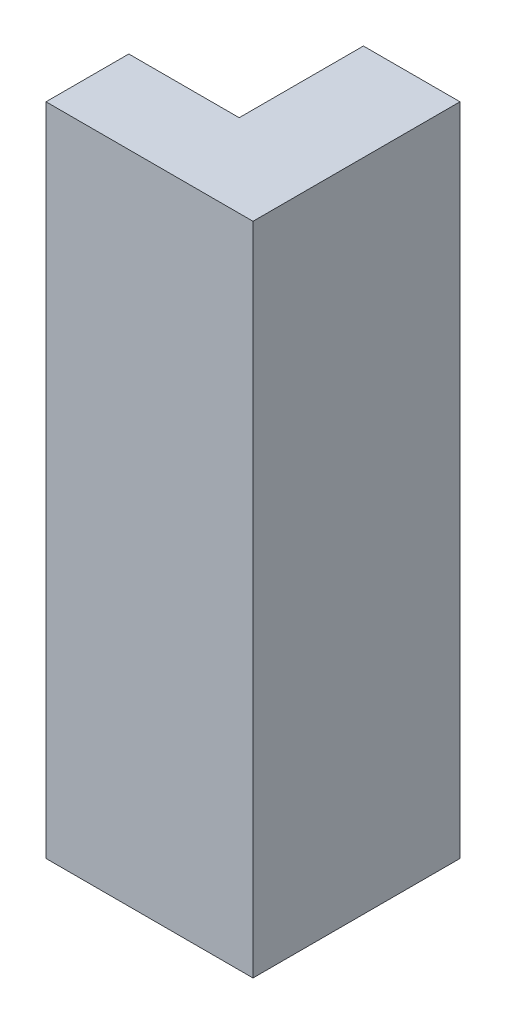
ISO-10303-21;
HEADER;
FILE_DESCRIPTION(('STEP AP214'),'2;1');
FILE_NAME('part.step','',(''),(''),'','','');
FILE_SCHEMA(('AUTOMOTIVE_DESIGN { 1 0 10303 214 1 1 1 1 }'));
ENDSEC;
DATA;
#1=APPLICATION_CONTEXT('core data for automotive mechanical design processes');
#2=APPLICATION_PROTOCOL_DEFINITION('international standard','automotive_design',2000,#1);
#3=PRODUCT_CONTEXT('',#1,'mechanical');
#4=PRODUCT('Part','Part','',(#3));
#5=PRODUCT_RELATED_PRODUCT_CATEGORY('part','',(#4));
#6=PRODUCT_DEFINITION_FORMATION('','',#4);
#7=PRODUCT_DEFINITION_CONTEXT('part definition',#1,'design');
#8=PRODUCT_DEFINITION('design','',#6,#7);
#9=PRODUCT_DEFINITION_SHAPE('','',#8);
#10=(LENGTH_UNIT() NAMED_UNIT(*) SI_UNIT(.MILLI.,.METRE.));
#11=(NAMED_UNIT(*) PLANE_ANGLE_UNIT() SI_UNIT($,.RADIAN.));
#12=(NAMED_UNIT(*) SI_UNIT($,.STERADIAN.) SOLID_ANGLE_UNIT());
#13=UNCERTAINTY_MEASURE_WITH_UNIT(LENGTH_MEASURE(1.E-05),#10,'distance_accuracy_value','');
#14=(GEOMETRIC_REPRESENTATION_CONTEXT(3) GLOBAL_UNCERTAINTY_ASSIGNED_CONTEXT((#13)) GLOBAL_UNIT_ASSIGNED_CONTEXT((#10,
#11,#12)) REPRESENTATION_CONTEXT('',''));
#15=CARTESIAN_POINT('',(0.,0.,0.));
#16=DIRECTION('',(0.,0.,1.));
#17=DIRECTION('',(1.,0.,0.));
#18=AXIS2_PLACEMENT_3D('',#15,#16,#17);
#19=CARTESIAN_POINT('',(87.5,1187.25,187.5));
#20=DIRECTION('',(-1.,0.,0.));
#21=DIRECTION('',(0.,0.,1.));
#22=AXIS2_PLACEMENT_3D('',#19,#20,#21);
#23=PLANE('',#22);
#24=DIRECTION('',(0.,0.,-1.));
#25=VECTOR('',#24,1.);
#26=CARTESIAN_POINT('',(87.5,0.,187.5));
#27=LINE('',#26,#25);
#28=CARTESIAN_POINT('',(87.5,0.,187.5));
#29=VERTEX_POINT('',#28);
#30=CARTESIAN_POINT('',(87.5,0.,-187.5));
#31=VERTEX_POINT('',#30);
#32=EDGE_CURVE('E127',#29,#31,#27,.T.);
#33=ORIENTED_EDGE('',*,*,#32,.T.);
#34=DIRECTION('',(0.,-1.,0.));
#35=VECTOR('',#34,1.);
#36=CARTESIAN_POINT('',(87.5,1187.25,-187.5));
#37=LINE('',#36,#35);
#38=CARTESIAN_POINT('',(87.5,1187.25,-187.5));
#39=VERTEX_POINT('',#38);
#40=EDGE_CURVE('E11',#39,#31,#37,.T.);
#41=ORIENTED_EDGE('',*,*,#40,.F.);
#42=DIRECTION('',(0.,0.,-1.));
#43=VECTOR('',#42,1.);
#44=CARTESIAN_POINT('',(87.5,1187.25,187.5));
#45=LINE('',#44,#43);
#46=CARTESIAN_POINT('',(87.5,1187.25,187.5));
#47=VERTEX_POINT('',#46);
#48=EDGE_CURVE('E137',#47,#39,#45,.T.);
#49=ORIENTED_EDGE('',*,*,#48,.F.);
#50=DIRECTION('',(0.,-1.,0.));
#51=VECTOR('',#50,1.);
#52=CARTESIAN_POINT('',(87.5,1187.25,187.5));
#53=LINE('',#52,#51);
#54=EDGE_CURVE('E123',#47,#29,#53,.T.);
#55=ORIENTED_EDGE('',*,*,#54,.T.);
#56=EDGE_LOOP('',(#33,#41,#49,#55));
#57=FACE_BOUND('',#56,.T.);
#58=ADVANCED_FACE('F43',(#57),#23,.F.);
#59=CARTESIAN_POINT('',(-87.5,1187.25,-187.5));
#60=DIRECTION('',(0.,0.,1.));
#61=DIRECTION('',(1.,0.,0.));
#62=AXIS2_PLACEMENT_3D('',#59,#60,#61);
#63=PLANE('',#62);
#64=DIRECTION('',(-1.,0.,0.));
#65=VECTOR('',#64,1.);
#66=CARTESIAN_POINT('',(-87.5,0.,-187.5));
#67=LINE('',#66,#65);
#68=CARTESIAN_POINT('',(-87.5,0.,-187.5));
#69=VERTEX_POINT('',#68);
#70=EDGE_CURVE('E130',#31,#69,#67,.T.);
#71=ORIENTED_EDGE('',*,*,#70,.T.);
#72=DIRECTION('',(0.,-1.,0.));
#73=VECTOR('',#72,1.);
#74=CARTESIAN_POINT('',(-87.5,1187.25,-187.5));
#75=LINE('',#74,#73);
#76=CARTESIAN_POINT('',(-87.5,1187.25,-187.5));
#77=VERTEX_POINT('',#76);
#78=EDGE_CURVE('E51',#77,#69,#75,.T.);
#79=ORIENTED_EDGE('',*,*,#78,.F.);
#80=DIRECTION('',(-1.,0.,0.));
#81=VECTOR('',#80,1.);
#82=CARTESIAN_POINT('',(-87.5,1187.25,-187.5));
#83=LINE('',#82,#81);
#84=EDGE_CURVE('E96',#39,#77,#83,.T.);
#85=ORIENTED_EDGE('',*,*,#84,.F.);
#86=ORIENTED_EDGE('',*,*,#40,.T.);
#87=EDGE_LOOP('',(#71,#79,#85,#86));
#88=FACE_BOUND('',#87,.T.);
#89=ADVANCED_FACE('F161',(#88),#63,.F.);
#90=CARTESIAN_POINT('',(-87.5,1187.25,37.4999999999999));
#91=DIRECTION('',(1.,0.,0.));
#92=DIRECTION('',(0.,0.,-1.));
#93=AXIS2_PLACEMENT_3D('',#90,#91,#92);
#94=PLANE('',#93);
#95=DIRECTION('',(0.,0.,1.));
#96=VECTOR('',#95,1.);
#97=CARTESIAN_POINT('',(-87.5,0.,37.4999999999999));
#98=LINE('',#97,#96);
#99=CARTESIAN_POINT('',(-87.5,0.,37.4999999999999));
#100=VERTEX_POINT('',#99);
#101=EDGE_CURVE('E132',#69,#100,#98,.T.);
#102=ORIENTED_EDGE('',*,*,#101,.T.);
#103=DIRECTION('',(0.,-1.,0.));
#104=VECTOR('',#103,1.);
#105=CARTESIAN_POINT('',(-87.5,1187.25,37.4999999999999));
#106=LINE('',#105,#104);
#107=CARTESIAN_POINT('',(-87.5,1187.25,37.4999999999999));
#108=VERTEX_POINT('',#107);
#109=EDGE_CURVE('E118',#108,#100,#106,.T.);
#110=ORIENTED_EDGE('',*,*,#109,.F.);
#111=DIRECTION('',(0.,0.,1.));
#112=VECTOR('',#111,1.);
#113=CARTESIAN_POINT('',(-87.5,1187.25,37.4999999999999));
#114=LINE('',#113,#112);
#115=EDGE_CURVE('E109',#77,#108,#114,.T.);
#116=ORIENTED_EDGE('',*,*,#115,.F.);
#117=ORIENTED_EDGE('',*,*,#78,.T.);
#118=EDGE_LOOP('',(#102,#110,#116,#117));
#119=FACE_BOUND('',#118,.T.);
#120=ADVANCED_FACE('F143',(#119),#94,.F.);
#121=CARTESIAN_POINT('',(-87.5,1187.25,37.4999999999999));
#122=DIRECTION('',(0.,0.,1.));
#123=DIRECTION('',(1.,0.,0.));
#124=AXIS2_PLACEMENT_3D('',#121,#122,#123);
#125=PLANE('',#124);
#126=DIRECTION('',(-1.,0.,0.));
#127=VECTOR('',#126,1.);
#128=CARTESIAN_POINT('',(-87.5,0.,37.4999999999999));
#129=LINE('',#128,#127);
#130=CARTESIAN_POINT('',(-287.5,0.,37.5));
#131=VERTEX_POINT('',#130);
#132=EDGE_CURVE('E117',#100,#131,#129,.T.);
#133=ORIENTED_EDGE('',*,*,#132,.T.);
#134=DIRECTION('',(0.,-1.,0.));
#135=VECTOR('',#134,1.);
#136=CARTESIAN_POINT('',(-287.5,1187.25,37.5));
#137=LINE('',#136,#135);
#138=CARTESIAN_POINT('',(-287.5,1187.25,37.5));
#139=VERTEX_POINT('',#138);
#140=EDGE_CURVE('E114',#139,#131,#137,.T.);
#141=ORIENTED_EDGE('',*,*,#140,.F.);
#142=DIRECTION('',(-1.,0.,0.));
#143=VECTOR('',#142,1.);
#144=CARTESIAN_POINT('',(-87.5,1187.25,37.4999999999999));
#145=LINE('',#144,#143);
#146=EDGE_CURVE('E103',#108,#139,#145,.T.);
#147=ORIENTED_EDGE('',*,*,#146,.F.);
#148=ORIENTED_EDGE('',*,*,#109,.T.);
#149=EDGE_LOOP('',(#133,#141,#147,#148));
#150=FACE_BOUND('',#149,.T.);
#151=ADVANCED_FACE('F115',(#150),#125,.F.);
#152=CARTESIAN_POINT('',(-287.5,1187.25,187.5));
#153=DIRECTION('',(1.,0.,0.));
#154=DIRECTION('',(0.,0.,-1.));
#155=AXIS2_PLACEMENT_3D('',#152,#153,#154);
#156=PLANE('',#155);
#157=DIRECTION('',(0.,0.,1.));
#158=VECTOR('',#157,1.);
#159=CARTESIAN_POINT('',(-287.5,0.,187.5));
#160=LINE('',#159,#158);
#161=CARTESIAN_POINT('',(-287.5,0.,187.5));
#162=VERTEX_POINT('',#161);
#163=EDGE_CURVE('E82',#131,#162,#160,.T.);
#164=ORIENTED_EDGE('',*,*,#163,.T.);
#165=DIRECTION('',(0.,-1.,0.));
#166=VECTOR('',#165,1.);
#167=CARTESIAN_POINT('',(-287.5,1187.25,187.5));
#168=LINE('',#167,#166);
#169=CARTESIAN_POINT('',(-287.5,1187.25,187.5));
#170=VERTEX_POINT('',#169);
#171=EDGE_CURVE('E119',#170,#162,#168,.T.);
#172=ORIENTED_EDGE('',*,*,#171,.F.);
#173=DIRECTION('',(0.,0.,1.));
#174=VECTOR('',#173,1.);
#175=CARTESIAN_POINT('',(-287.5,1187.25,187.5));
#176=LINE('',#175,#174);
#177=EDGE_CURVE('E107',#139,#170,#176,.T.);
#178=ORIENTED_EDGE('',*,*,#177,.F.);
#179=ORIENTED_EDGE('',*,*,#140,.T.);
#180=EDGE_LOOP('',(#164,#172,#178,#179));
#181=FACE_BOUND('',#180,.T.);
#182=ADVANCED_FACE('F121',(#181),#156,.F.);
#183=CARTESIAN_POINT('',(-287.5,1187.25,187.5));
#184=DIRECTION('',(0.,0.,-1.));
#185=DIRECTION('',(-1.,0.,0.));
#186=AXIS2_PLACEMENT_3D('',#183,#184,#185);
#187=PLANE('',#186);
#188=DIRECTION('',(1.,0.,0.));
#189=VECTOR('',#188,1.);
#190=CARTESIAN_POINT('',(-287.5,0.,187.5));
#191=LINE('',#190,#189);
#192=EDGE_CURVE('E88',#162,#29,#191,.T.);
#193=ORIENTED_EDGE('',*,*,#192,.T.);
#194=ORIENTED_EDGE('',*,*,#54,.F.);
#195=DIRECTION('',(1.,0.,0.));
#196=VECTOR('',#195,1.);
#197=CARTESIAN_POINT('',(-287.5,1187.25,187.5));
#198=LINE('',#197,#196);
#199=EDGE_CURVE('E59',#170,#47,#198,.T.);
#200=ORIENTED_EDGE('',*,*,#199,.F.);
#201=ORIENTED_EDGE('',*,*,#171,.T.);
#202=EDGE_LOOP('',(#193,#194,#200,#201));
#203=FACE_BOUND('',#202,.T.);
#204=ADVANCED_FACE('F150',(#203),#187,.F.);
#205=CARTESIAN_POINT('',(0.,1187.25,0.));
#206=DIRECTION('',(0.,-1.,0.));
#207=DIRECTION('',(0.,0.,-1.));
#208=AXIS2_PLACEMENT_3D('',#205,#206,#207);
#209=PLANE('',#208);
#210=ORIENTED_EDGE('',*,*,#48,.T.);
#211=ORIENTED_EDGE('',*,*,#84,.T.);
#212=ORIENTED_EDGE('',*,*,#115,.T.);
#213=ORIENTED_EDGE('',*,*,#146,.T.);
#214=ORIENTED_EDGE('',*,*,#177,.T.);
#215=ORIENTED_EDGE('',*,*,#199,.T.);
#216=EDGE_LOOP('',(#210,#211,#212,#213,#214,#215));
#217=FACE_BOUND('',#216,.T.);
#218=ADVANCED_FACE('F105',(#217),#209,.F.);
#219=CARTESIAN_POINT('',(0.,0.,0.));
#220=DIRECTION('',(0.,-1.,0.));
#221=DIRECTION('',(0.,0.,-1.));
#222=AXIS2_PLACEMENT_3D('',#219,#220,#221);
#223=PLANE('',#222);
#224=ORIENTED_EDGE('',*,*,#32,.F.);
#225=ORIENTED_EDGE('',*,*,#192,.F.);
#226=ORIENTED_EDGE('',*,*,#163,.F.);
#227=ORIENTED_EDGE('',*,*,#132,.F.);
#228=ORIENTED_EDGE('',*,*,#101,.F.);
#229=ORIENTED_EDGE('',*,*,#70,.F.);
#230=EDGE_LOOP('',(#224,#225,#226,#227,#228,#229));
#231=FACE_BOUND('',#230,.T.);
#232=ADVANCED_FACE('F146',(#231),#223,.T.);
#233=CLOSED_SHELL('',(#58,#89,#120,#151,#182,#204,#218,#232));
#234=MANIFOLD_SOLID_BREP('B2',#233);
#235=ADVANCED_BREP_SHAPE_REPRESENTATION('',(#18,#234),#14);
#236=SHAPE_DEFINITION_REPRESENTATION(#9,#235);
ENDSEC;
END-ISO-10303-21;
